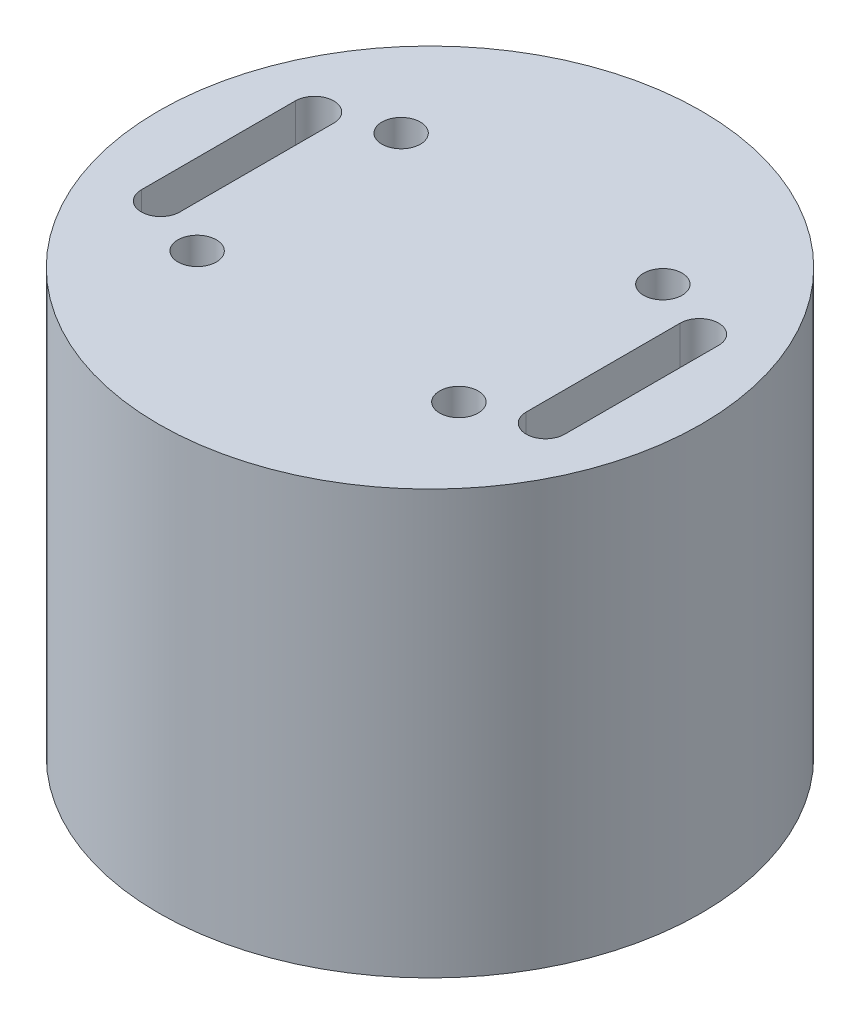
ISO-10303-21;
HEADER;
FILE_DESCRIPTION(('STEP AP214'),'2;1');
FILE_NAME('part.step','',(''),(''),'','','');
FILE_SCHEMA(('AUTOMOTIVE_DESIGN { 1 0 10303 214 1 1 1 1 }'));
ENDSEC;
DATA;
#1=APPLICATION_CONTEXT('core data for automotive mechanical design processes');
#2=APPLICATION_PROTOCOL_DEFINITION('international standard','automotive_design',2000,#1);
#3=PRODUCT_CONTEXT('',#1,'mechanical');
#4=PRODUCT('Part','Part','',(#3));
#5=PRODUCT_RELATED_PRODUCT_CATEGORY('part','',(#4));
#6=PRODUCT_DEFINITION_FORMATION('','',#4);
#7=PRODUCT_DEFINITION_CONTEXT('part definition',#1,'design');
#8=PRODUCT_DEFINITION('design','',#6,#7);
#9=PRODUCT_DEFINITION_SHAPE('','',#8);
#10=(LENGTH_UNIT() NAMED_UNIT(*) SI_UNIT(.MILLI.,.METRE.));
#11=(NAMED_UNIT(*) PLANE_ANGLE_UNIT() SI_UNIT($,.RADIAN.));
#12=(NAMED_UNIT(*) SI_UNIT($,.STERADIAN.) SOLID_ANGLE_UNIT());
#13=UNCERTAINTY_MEASURE_WITH_UNIT(LENGTH_MEASURE(1.E-05),#10,'distance_accuracy_value','');
#14=(GEOMETRIC_REPRESENTATION_CONTEXT(3) GLOBAL_UNCERTAINTY_ASSIGNED_CONTEXT((#13)) GLOBAL_UNIT_ASSIGNED_CONTEXT((#10,
#11,#12)) REPRESENTATION_CONTEXT('',''));
#15=CARTESIAN_POINT('',(0.,0.,0.));
#16=DIRECTION('',(0.,0.,1.));
#17=DIRECTION('',(1.,0.,0.));
#18=AXIS2_PLACEMENT_3D('',#15,#16,#17);
#19=CARTESIAN_POINT('',(0.,0.,0.));
#20=DIRECTION('',(0.,1.,0.));
#21=DIRECTION('',(0.,0.,1.));
#22=AXIS2_PLACEMENT_3D('',#19,#20,#21);
#23=PLANE('',#22);
#24=CARTESIAN_POINT('',(0.,0.,0.));
#25=DIRECTION('',(0.,-1.,0.));
#26=DIRECTION('',(0.,0.,-1.));
#27=AXIS2_PLACEMENT_3D('',#24,#25,#26);
#28=CIRCLE('',#27,60.5);
#29=CARTESIAN_POINT('',(0.,0.,-60.5));
#30=VERTEX_POINT('',#29);
#31=EDGE_CURVE('E199',#30,#30,#28,.T.);
#32=ORIENTED_EDGE('',*,*,#31,.T.);
#33=EDGE_LOOP('',(#32));
#34=FACE_BOUND('',#33,.T.);
#35=CARTESIAN_POINT('',(-34.,0.,-26.5));
#36=DIRECTION('',(0.,1.,0.));
#37=DIRECTION('',(0.,0.,1.));
#38=AXIS2_PLACEMENT_3D('',#35,#36,#37);
#39=CIRCLE('',#38,5.);
#40=CARTESIAN_POINT('',(-34.,0.,-21.5));
#41=VERTEX_POINT('',#40);
#42=EDGE_CURVE('E211',#41,#41,#39,.T.);
#43=ORIENTED_EDGE('',*,*,#42,.T.);
#44=EDGE_LOOP('',(#43));
#45=FACE_BOUND('',#44,.T.);
#46=CARTESIAN_POINT('',(34.,0.,-26.5));
#47=DIRECTION('',(0.,1.,0.));
#48=DIRECTION('',(0.,0.,1.));
#49=AXIS2_PLACEMENT_3D('',#46,#47,#48);
#50=CIRCLE('',#49,5.);
#51=CARTESIAN_POINT('',(34.,0.,-21.5));
#52=VERTEX_POINT('',#51);
#53=EDGE_CURVE('E225',#52,#52,#50,.T.);
#54=ORIENTED_EDGE('',*,*,#53,.T.);
#55=EDGE_LOOP('',(#54));
#56=FACE_BOUND('',#55,.T.);
#57=CARTESIAN_POINT('',(34.,0.,26.5));
#58=DIRECTION('',(0.,1.,0.));
#59=DIRECTION('',(0.,0.,1.));
#60=AXIS2_PLACEMENT_3D('',#57,#58,#59);
#61=CIRCLE('',#60,5.);
#62=CARTESIAN_POINT('',(34.,0.,31.5));
#63=VERTEX_POINT('',#62);
#64=EDGE_CURVE('E217',#63,#63,#61,.T.);
#65=ORIENTED_EDGE('',*,*,#64,.T.);
#66=EDGE_LOOP('',(#65));
#67=FACE_BOUND('',#66,.T.);
#68=CARTESIAN_POINT('',(-34.,0.,26.5));
#69=DIRECTION('',(0.,1.,0.));
#70=DIRECTION('',(0.,0.,1.));
#71=AXIS2_PLACEMENT_3D('',#68,#69,#70);
#72=CIRCLE('',#71,5.);
#73=CARTESIAN_POINT('',(-34.,0.,31.5));
#74=VERTEX_POINT('',#73);
#75=EDGE_CURVE('E53',#74,#74,#72,.T.);
#76=ORIENTED_EDGE('',*,*,#75,.T.);
#77=EDGE_LOOP('',(#76));
#78=FACE_BOUND('',#77,.T.);
#79=DIRECTION('',(0.,0.,-1.));
#80=VECTOR('',#79,1.);
#81=CARTESIAN_POINT('',(55.,0.,0.));
#82=LINE('',#81,#80);
#83=CARTESIAN_POINT('',(55.,0.,20.));
#84=VERTEX_POINT('',#83);
#85=CARTESIAN_POINT('',(55.,0.,-20.));
#86=VERTEX_POINT('',#85);
#87=EDGE_CURVE('E191',#84,#86,#82,.T.);
#88=ORIENTED_EDGE('',*,*,#87,.T.);
#89=CARTESIAN_POINT('',(50.,0.,-20.));
#90=DIRECTION('',(0.,1.,0.));
#91=DIRECTION('',(0.,0.,1.));
#92=AXIS2_PLACEMENT_3D('',#89,#90,#91);
#93=CIRCLE('',#92,5.00000000000001);
#94=CARTESIAN_POINT('',(45.,0.,-20.));
#95=VERTEX_POINT('',#94);
#96=EDGE_CURVE('E195',#86,#95,#93,.T.);
#97=ORIENTED_EDGE('',*,*,#96,.T.);
#98=DIRECTION('',(0.,0.,1.));
#99=VECTOR('',#98,1.);
#100=CARTESIAN_POINT('',(45.,0.,0.));
#101=LINE('',#100,#99);
#102=CARTESIAN_POINT('',(45.,0.,20.));
#103=VERTEX_POINT('',#102);
#104=EDGE_CURVE('E174',#95,#103,#101,.T.);
#105=ORIENTED_EDGE('',*,*,#104,.T.);
#106=CARTESIAN_POINT('',(50.,0.,20.));
#107=DIRECTION('',(0.,1.,0.));
#108=DIRECTION('',(0.,0.,1.));
#109=AXIS2_PLACEMENT_3D('',#106,#107,#108);
#110=CIRCLE('',#109,5.00000000000001);
#111=EDGE_CURVE('E187',#103,#84,#110,.T.);
#112=ORIENTED_EDGE('',*,*,#111,.T.);
#113=EDGE_LOOP('',(#88,#97,#105,#112));
#114=FACE_BOUND('',#113,.T.);
#115=CARTESIAN_POINT('',(-50.,0.,-20.));
#116=DIRECTION('',(0.,1.,0.));
#117=DIRECTION('',(0.,0.,1.));
#118=AXIS2_PLACEMENT_3D('',#115,#116,#117);
#119=CIRCLE('',#118,5.00000000000001);
#120=CARTESIAN_POINT('',(-55.,0.,-20.));
#121=VERTEX_POINT('',#120);
#122=CARTESIAN_POINT('',(-45.,0.,-20.));
#123=VERTEX_POINT('',#122);
#124=EDGE_CURVE('E152',#121,#123,#119,.F.);
#125=ORIENTED_EDGE('',*,*,#124,.F.);
#126=DIRECTION('',(0.,0.,-1.));
#127=VECTOR('',#126,1.);
#128=CARTESIAN_POINT('',(-55.,0.,0.));
#129=LINE('',#128,#127);
#130=CARTESIAN_POINT('',(-55.,0.,20.));
#131=VERTEX_POINT('',#130);
#132=EDGE_CURVE('E140',#131,#121,#129,.T.);
#133=ORIENTED_EDGE('',*,*,#132,.F.);
#134=CARTESIAN_POINT('',(-50.,0.,20.));
#135=DIRECTION('',(0.,1.,0.));
#136=DIRECTION('',(0.,0.,1.));
#137=AXIS2_PLACEMENT_3D('',#134,#135,#136);
#138=CIRCLE('',#137,5.00000000000001);
#139=CARTESIAN_POINT('',(-45.,0.,20.));
#140=VERTEX_POINT('',#139);
#141=EDGE_CURVE('E116',#140,#131,#138,.F.);
#142=ORIENTED_EDGE('',*,*,#141,.F.);
#143=DIRECTION('',(0.,0.,1.));
#144=VECTOR('',#143,1.);
#145=CARTESIAN_POINT('',(-45.,0.,0.));
#146=LINE('',#145,#144);
#147=EDGE_CURVE('E149',#123,#140,#146,.T.);
#148=ORIENTED_EDGE('',*,*,#147,.F.);
#149=EDGE_LOOP('',(#125,#133,#142,#148));
#150=FACE_BOUND('',#149,.T.);
#151=ADVANCED_FACE('F44',(#34,#45,#56,#67,#78,#114,#150),#23,.F.);
#152=CARTESIAN_POINT('',(0.,10.,0.));
#153=DIRECTION('',(0.,1.,0.));
#154=DIRECTION('',(0.,0.,1.));
#155=AXIS2_PLACEMENT_3D('',#152,#153,#154);
#156=PLANE('',#155);
#157=CARTESIAN_POINT('',(50.,10.,-20.));
#158=DIRECTION('',(0.,1.,0.));
#159=DIRECTION('',(0.,0.,1.));
#160=AXIS2_PLACEMENT_3D('',#157,#158,#159);
#161=CIRCLE('',#160,5.00000000000001);
#162=CARTESIAN_POINT('',(55.,10.,-20.));
#163=VERTEX_POINT('',#162);
#164=CARTESIAN_POINT('',(45.,10.,-20.));
#165=VERTEX_POINT('',#164);
#166=EDGE_CURVE('E155',#163,#165,#161,.T.);
#167=ORIENTED_EDGE('',*,*,#166,.F.);
#168=DIRECTION('',(0.,0.,-1.));
#169=VECTOR('',#168,1.);
#170=CARTESIAN_POINT('',(55.,10.,-20.));
#171=LINE('',#170,#169);
#172=CARTESIAN_POINT('',(55.,10.,20.));
#173=VERTEX_POINT('',#172);
#174=EDGE_CURVE('E166',#173,#163,#171,.T.);
#175=ORIENTED_EDGE('',*,*,#174,.F.);
#176=CARTESIAN_POINT('',(50.,10.,20.));
#177=DIRECTION('',(0.,1.,0.));
#178=DIRECTION('',(0.,0.,1.));
#179=AXIS2_PLACEMENT_3D('',#176,#177,#178);
#180=CIRCLE('',#179,5.00000000000001);
#181=CARTESIAN_POINT('',(45.,10.,20.));
#182=VERTEX_POINT('',#181);
#183=EDGE_CURVE('E162',#182,#173,#180,.T.);
#184=ORIENTED_EDGE('',*,*,#183,.F.);
#185=DIRECTION('',(0.,0.,1.));
#186=VECTOR('',#185,1.);
#187=CARTESIAN_POINT('',(45.,10.,-20.));
#188=LINE('',#187,#186);
#189=EDGE_CURVE('E158',#165,#182,#188,.T.);
#190=ORIENTED_EDGE('',*,*,#189,.F.);
#191=EDGE_LOOP('',(#167,#175,#184,#190));
#192=FACE_BOUND('',#191,.T.);
#193=CARTESIAN_POINT('',(-34.,10.,-26.5));
#194=DIRECTION('',(0.,1.,0.));
#195=DIRECTION('',(0.,0.,1.));
#196=AXIS2_PLACEMENT_3D('',#193,#194,#195);
#197=CIRCLE('',#196,5.);
#198=CARTESIAN_POINT('',(-34.,10.,-21.5));
#199=VERTEX_POINT('',#198);
#200=EDGE_CURVE('E229',#199,#199,#197,.T.);
#201=ORIENTED_EDGE('',*,*,#200,.F.);
#202=EDGE_LOOP('',(#201));
#203=FACE_BOUND('',#202,.T.);
#204=CARTESIAN_POINT('',(34.,10.,-26.5));
#205=DIRECTION('',(0.,1.,0.));
#206=DIRECTION('',(0.,0.,1.));
#207=AXIS2_PLACEMENT_3D('',#204,#205,#206);
#208=CIRCLE('',#207,5.);
#209=CARTESIAN_POINT('',(34.,10.,-21.5));
#210=VERTEX_POINT('',#209);
#211=EDGE_CURVE('E221',#210,#210,#208,.T.);
#212=ORIENTED_EDGE('',*,*,#211,.F.);
#213=EDGE_LOOP('',(#212));
#214=FACE_BOUND('',#213,.T.);
#215=CARTESIAN_POINT('',(34.,10.,26.5));
#216=DIRECTION('',(0.,1.,0.));
#217=DIRECTION('',(0.,0.,1.));
#218=AXIS2_PLACEMENT_3D('',#215,#216,#217);
#219=CIRCLE('',#218,5.);
#220=CARTESIAN_POINT('',(34.,10.,31.5));
#221=VERTEX_POINT('',#220);
#222=EDGE_CURVE('E212',#221,#221,#219,.T.);
#223=ORIENTED_EDGE('',*,*,#222,.F.);
#224=EDGE_LOOP('',(#223));
#225=FACE_BOUND('',#224,.T.);
#226=CARTESIAN_POINT('',(-34.,10.,26.5));
#227=DIRECTION('',(0.,1.,0.));
#228=DIRECTION('',(0.,0.,1.));
#229=AXIS2_PLACEMENT_3D('',#226,#227,#228);
#230=CIRCLE('',#229,5.);
#231=CARTESIAN_POINT('',(-34.,10.,31.5));
#232=VERTEX_POINT('',#231);
#233=EDGE_CURVE('E216',#232,#232,#230,.T.);
#234=ORIENTED_EDGE('',*,*,#233,.F.);
#235=EDGE_LOOP('',(#234));
#236=FACE_BOUND('',#235,.T.);
#237=CARTESIAN_POINT('',(0.,10.,0.));
#238=DIRECTION('',(0.,1.,0.));
#239=DIRECTION('',(0.,0.,1.));
#240=AXIS2_PLACEMENT_3D('',#237,#238,#239);
#241=CIRCLE('',#240,70.5);
#242=CARTESIAN_POINT('',(0.,10.,70.5));
#243=VERTEX_POINT('',#242);
#244=EDGE_CURVE('E11',#243,#243,#241,.T.);
#245=ORIENTED_EDGE('',*,*,#244,.T.);
#246=EDGE_LOOP('',(#245));
#247=FACE_BOUND('',#246,.T.);
#248=DIRECTION('',(0.,0.,-1.));
#249=VECTOR('',#248,1.);
#250=CARTESIAN_POINT('',(-55.,10.,-20.));
#251=LINE('',#250,#249);
#252=CARTESIAN_POINT('',(-55.,10.,20.));
#253=VERTEX_POINT('',#252);
#254=CARTESIAN_POINT('',(-55.,10.,-20.));
#255=VERTEX_POINT('',#254);
#256=EDGE_CURVE('E123',#253,#255,#251,.T.);
#257=ORIENTED_EDGE('',*,*,#256,.T.);
#258=CARTESIAN_POINT('',(-50.,10.,-20.));
#259=DIRECTION('',(0.,-1.,0.));
#260=DIRECTION('',(0.,0.,1.));
#261=AXIS2_PLACEMENT_3D('',#258,#259,#260);
#262=CIRCLE('',#261,5.00000000000001);
#263=CARTESIAN_POINT('',(-45.,10.,-20.));
#264=VERTEX_POINT('',#263);
#265=EDGE_CURVE('E68',#255,#264,#262,.T.);
#266=ORIENTED_EDGE('',*,*,#265,.T.);
#267=DIRECTION('',(0.,0.,1.));
#268=VECTOR('',#267,1.);
#269=CARTESIAN_POINT('',(-45.,10.,-20.));
#270=LINE('',#269,#268);
#271=CARTESIAN_POINT('',(-45.,10.,20.));
#272=VERTEX_POINT('',#271);
#273=EDGE_CURVE('E130',#264,#272,#270,.T.);
#274=ORIENTED_EDGE('',*,*,#273,.T.);
#275=CARTESIAN_POINT('',(-50.,10.,20.));
#276=DIRECTION('',(0.,-1.,0.));
#277=DIRECTION('',(0.,0.,1.));
#278=AXIS2_PLACEMENT_3D('',#275,#276,#277);
#279=CIRCLE('',#278,5.00000000000001);
#280=EDGE_CURVE('E113',#272,#253,#279,.T.);
#281=ORIENTED_EDGE('',*,*,#280,.T.);
#282=EDGE_LOOP('',(#257,#266,#274,#281));
#283=FACE_BOUND('',#282,.T.);
#284=ADVANCED_FACE('F128',(#192,#203,#214,#225,#236,#247,#283),#156,.T.);
#285=CARTESIAN_POINT('',(0.,10.,0.));
#286=DIRECTION('',(0.,-1.,0.));
#287=DIRECTION('',(0.,0.,-1.));
#288=AXIS2_PLACEMENT_3D('',#285,#286,#287);
#289=CYLINDRICAL_SURFACE('',#288,70.5);
#290=ORIENTED_EDGE('',*,*,#244,.F.);
#291=EDGE_LOOP('',(#290));
#292=FACE_BOUND('',#291,.T.);
#293=CARTESIAN_POINT('',(0.,-100.,0.));
#294=DIRECTION('',(0.,-1.,0.));
#295=DIRECTION('',(0.,0.,-1.));
#296=AXIS2_PLACEMENT_3D('',#293,#294,#295);
#297=CIRCLE('',#296,70.5);
#298=CARTESIAN_POINT('',(0.,-100.,-70.5));
#299=VERTEX_POINT('',#298);
#300=EDGE_CURVE('E204',#299,#299,#297,.T.);
#301=ORIENTED_EDGE('',*,*,#300,.F.);
#302=EDGE_LOOP('',(#301));
#303=FACE_BOUND('',#302,.T.);
#304=ADVANCED_FACE('F46',(#292,#303),#289,.T.);
#305=CARTESIAN_POINT('',(-34.,0.,26.5));
#306=DIRECTION('',(0.,1.,0.));
#307=DIRECTION('',(0.,0.,1.));
#308=AXIS2_PLACEMENT_3D('',#305,#306,#307);
#309=CYLINDRICAL_SURFACE('',#308,5.);
#310=ORIENTED_EDGE('',*,*,#75,.F.);
#311=EDGE_LOOP('',(#310));
#312=FACE_BOUND('',#311,.T.);
#313=ORIENTED_EDGE('',*,*,#233,.T.);
#314=EDGE_LOOP('',(#313));
#315=FACE_BOUND('',#314,.T.);
#316=ADVANCED_FACE('F242',(#312,#315),#309,.F.);
#317=CARTESIAN_POINT('',(34.,0.,26.5));
#318=DIRECTION('',(0.,1.,0.));
#319=DIRECTION('',(0.,0.,1.));
#320=AXIS2_PLACEMENT_3D('',#317,#318,#319);
#321=CYLINDRICAL_SURFACE('',#320,5.);
#322=ORIENTED_EDGE('',*,*,#64,.F.);
#323=EDGE_LOOP('',(#322));
#324=FACE_BOUND('',#323,.T.);
#325=ORIENTED_EDGE('',*,*,#222,.T.);
#326=EDGE_LOOP('',(#325));
#327=FACE_BOUND('',#326,.T.);
#328=ADVANCED_FACE('F312',(#324,#327),#321,.F.);
#329=CARTESIAN_POINT('',(34.,0.,-26.5));
#330=DIRECTION('',(0.,1.,0.));
#331=DIRECTION('',(0.,0.,1.));
#332=AXIS2_PLACEMENT_3D('',#329,#330,#331);
#333=CYLINDRICAL_SURFACE('',#332,5.);
#334=ORIENTED_EDGE('',*,*,#53,.F.);
#335=EDGE_LOOP('',(#334));
#336=FACE_BOUND('',#335,.T.);
#337=ORIENTED_EDGE('',*,*,#211,.T.);
#338=EDGE_LOOP('',(#337));
#339=FACE_BOUND('',#338,.T.);
#340=ADVANCED_FACE('F315',(#336,#339),#333,.F.);
#341=CARTESIAN_POINT('',(-34.,0.,-26.5));
#342=DIRECTION('',(0.,1.,0.));
#343=DIRECTION('',(0.,0.,1.));
#344=AXIS2_PLACEMENT_3D('',#341,#342,#343);
#345=CYLINDRICAL_SURFACE('',#344,5.);
#346=ORIENTED_EDGE('',*,*,#42,.F.);
#347=EDGE_LOOP('',(#346));
#348=FACE_BOUND('',#347,.T.);
#349=ORIENTED_EDGE('',*,*,#200,.T.);
#350=EDGE_LOOP('',(#349));
#351=FACE_BOUND('',#350,.T.);
#352=ADVANCED_FACE('F258',(#348,#351),#345,.F.);
#353=CARTESIAN_POINT('',(0.,-100.,0.));
#354=DIRECTION('',(0.,-1.,0.));
#355=DIRECTION('',(0.,0.,-1.));
#356=AXIS2_PLACEMENT_3D('',#353,#354,#355);
#357=PLANE('',#356);
#358=ORIENTED_EDGE('',*,*,#300,.T.);
#359=EDGE_LOOP('',(#358));
#360=FACE_BOUND('',#359,.T.);
#361=CARTESIAN_POINT('',(0.,-100.,0.));
#362=DIRECTION('',(0.,-1.,0.));
#363=DIRECTION('',(0.,0.,-1.));
#364=AXIS2_PLACEMENT_3D('',#361,#362,#363);
#365=CIRCLE('',#364,60.5);
#366=CARTESIAN_POINT('',(0.,-100.,-60.5));
#367=VERTEX_POINT('',#366);
#368=EDGE_CURVE('E200',#367,#367,#365,.T.);
#369=ORIENTED_EDGE('',*,*,#368,.F.);
#370=EDGE_LOOP('',(#369));
#371=FACE_BOUND('',#370,.T.);
#372=ADVANCED_FACE('F254',(#360,#371),#357,.T.);
#373=CARTESIAN_POINT('',(0.,-100.,0.));
#374=DIRECTION('',(0.,1.,0.));
#375=DIRECTION('',(0.,0.,1.));
#376=AXIS2_PLACEMENT_3D('',#373,#374,#375);
#377=CYLINDRICAL_SURFACE('',#376,60.5);
#378=ORIENTED_EDGE('',*,*,#368,.T.);
#379=EDGE_LOOP('',(#378));
#380=FACE_BOUND('',#379,.T.);
#381=ORIENTED_EDGE('',*,*,#31,.F.);
#382=EDGE_LOOP('',(#381));
#383=FACE_BOUND('',#382,.T.);
#384=ADVANCED_FACE('F257',(#380,#383),#377,.F.);
#385=CARTESIAN_POINT('',(50.,-100.,-20.));
#386=DIRECTION('',(0.,1.,0.));
#387=DIRECTION('',(0.,0.,1.));
#388=AXIS2_PLACEMENT_3D('',#385,#386,#387);
#389=CYLINDRICAL_SURFACE('',#388,5.00000000000001);
#390=DIRECTION('',(0.,1.,0.));
#391=VECTOR('',#390,1.);
#392=CARTESIAN_POINT('',(55.,-100.,-20.));
#393=LINE('',#392,#391);
#394=EDGE_CURVE('E171',#86,#163,#393,.T.);
#395=ORIENTED_EDGE('',*,*,#394,.T.);
#396=ORIENTED_EDGE('',*,*,#166,.T.);
#397=DIRECTION('',(0.,1.,0.));
#398=VECTOR('',#397,1.);
#399=CARTESIAN_POINT('',(45.,-100.,-20.));
#400=LINE('',#399,#398);
#401=EDGE_CURVE('E170',#95,#165,#400,.T.);
#402=ORIENTED_EDGE('',*,*,#401,.F.);
#403=ORIENTED_EDGE('',*,*,#96,.F.);
#404=EDGE_LOOP('',(#395,#396,#402,#403));
#405=FACE_BOUND('',#404,.T.);
#406=ADVANCED_FACE('F264',(#405),#389,.F.);
#407=CARTESIAN_POINT('',(55.,-100.,-20.));
#408=DIRECTION('',(1.,0.,0.));
#409=DIRECTION('',(0.,0.,-1.));
#410=AXIS2_PLACEMENT_3D('',#407,#408,#409);
#411=PLANE('',#410);
#412=DIRECTION('',(0.,1.,0.));
#413=VECTOR('',#412,1.);
#414=CARTESIAN_POINT('',(55.,-100.,20.));
#415=LINE('',#414,#413);
#416=EDGE_CURVE('E175',#84,#173,#415,.T.);
#417=ORIENTED_EDGE('',*,*,#416,.T.);
#418=ORIENTED_EDGE('',*,*,#174,.T.);
#419=ORIENTED_EDGE('',*,*,#394,.F.);
#420=ORIENTED_EDGE('',*,*,#87,.F.);
#421=EDGE_LOOP('',(#417,#418,#419,#420));
#422=FACE_BOUND('',#421,.T.);
#423=ADVANCED_FACE('F298',(#422),#411,.F.);
#424=CARTESIAN_POINT('',(50.,-100.,20.));
#425=DIRECTION('',(0.,1.,0.));
#426=DIRECTION('',(0.,0.,1.));
#427=AXIS2_PLACEMENT_3D('',#424,#425,#426);
#428=CYLINDRICAL_SURFACE('',#427,5.00000000000001);
#429=DIRECTION('',(0.,1.,0.));
#430=VECTOR('',#429,1.);
#431=CARTESIAN_POINT('',(45.,-100.,20.));
#432=LINE('',#431,#430);
#433=EDGE_CURVE('E178',#103,#182,#432,.T.);
#434=ORIENTED_EDGE('',*,*,#433,.T.);
#435=ORIENTED_EDGE('',*,*,#183,.T.);
#436=ORIENTED_EDGE('',*,*,#416,.F.);
#437=ORIENTED_EDGE('',*,*,#111,.F.);
#438=EDGE_LOOP('',(#434,#435,#436,#437));
#439=FACE_BOUND('',#438,.T.);
#440=ADVANCED_FACE('F301',(#439),#428,.F.);
#441=CARTESIAN_POINT('',(45.,-100.,-20.));
#442=DIRECTION('',(-1.,0.,0.));
#443=DIRECTION('',(0.,0.,1.));
#444=AXIS2_PLACEMENT_3D('',#441,#442,#443);
#445=PLANE('',#444);
#446=ORIENTED_EDGE('',*,*,#401,.T.);
#447=ORIENTED_EDGE('',*,*,#189,.T.);
#448=ORIENTED_EDGE('',*,*,#433,.F.);
#449=ORIENTED_EDGE('',*,*,#104,.F.);
#450=EDGE_LOOP('',(#446,#447,#448,#449));
#451=FACE_BOUND('',#450,.T.);
#452=ADVANCED_FACE('F293',(#451),#445,.F.);
#453=CARTESIAN_POINT('',(-50.,-100.,-20.));
#454=DIRECTION('',(0.,1.,0.));
#455=DIRECTION('',(0.,0.,1.));
#456=AXIS2_PLACEMENT_3D('',#453,#454,#455);
#457=CYLINDRICAL_SURFACE('',#456,5.00000000000001);
#458=ORIENTED_EDGE('',*,*,#124,.T.);
#459=DIRECTION('',(0.,1.,0.));
#460=VECTOR('',#459,1.);
#461=CARTESIAN_POINT('',(-45.,-100.,-20.));
#462=LINE('',#461,#460);
#463=EDGE_CURVE('E137',#123,#264,#462,.T.);
#464=ORIENTED_EDGE('',*,*,#463,.T.);
#465=ORIENTED_EDGE('',*,*,#265,.F.);
#466=DIRECTION('',(0.,1.,0.));
#467=VECTOR('',#466,1.);
#468=CARTESIAN_POINT('',(-55.,-100.,-20.));
#469=LINE('',#468,#467);
#470=EDGE_CURVE('E120',#121,#255,#469,.T.);
#471=ORIENTED_EDGE('',*,*,#470,.F.);
#472=EDGE_LOOP('',(#458,#464,#465,#471));
#473=FACE_BOUND('',#472,.T.);
#474=ADVANCED_FACE('F282',(#473),#457,.F.);
#475=CARTESIAN_POINT('',(-45.,-100.,-20.));
#476=DIRECTION('',(-1.,0.,0.));
#477=DIRECTION('',(0.,0.,1.));
#478=AXIS2_PLACEMENT_3D('',#475,#476,#477);
#479=PLANE('',#478);
#480=ORIENTED_EDGE('',*,*,#147,.T.);
#481=DIRECTION('',(0.,1.,0.));
#482=VECTOR('',#481,1.);
#483=CARTESIAN_POINT('',(-45.,-100.,20.));
#484=LINE('',#483,#482);
#485=EDGE_CURVE('E119',#140,#272,#484,.T.);
#486=ORIENTED_EDGE('',*,*,#485,.T.);
#487=ORIENTED_EDGE('',*,*,#273,.F.);
#488=ORIENTED_EDGE('',*,*,#463,.F.);
#489=EDGE_LOOP('',(#480,#486,#487,#488));
#490=FACE_BOUND('',#489,.T.);
#491=ADVANCED_FACE('F284',(#490),#479,.T.);
#492=CARTESIAN_POINT('',(-50.,-100.,20.));
#493=DIRECTION('',(0.,1.,0.));
#494=DIRECTION('',(0.,0.,1.));
#495=AXIS2_PLACEMENT_3D('',#492,#493,#494);
#496=CYLINDRICAL_SURFACE('',#495,5.00000000000001);
#497=ORIENTED_EDGE('',*,*,#141,.T.);
#498=DIRECTION('',(0.,1.,0.));
#499=VECTOR('',#498,1.);
#500=CARTESIAN_POINT('',(-55.,-100.,20.));
#501=LINE('',#500,#499);
#502=EDGE_CURVE('E60',#131,#253,#501,.T.);
#503=ORIENTED_EDGE('',*,*,#502,.T.);
#504=ORIENTED_EDGE('',*,*,#280,.F.);
#505=ORIENTED_EDGE('',*,*,#485,.F.);
#506=EDGE_LOOP('',(#497,#503,#504,#505));
#507=FACE_BOUND('',#506,.T.);
#508=ADVANCED_FACE('F110',(#507),#496,.F.);
#509=CARTESIAN_POINT('',(-55.,-100.,-20.));
#510=DIRECTION('',(1.,0.,0.));
#511=DIRECTION('',(0.,0.,-1.));
#512=AXIS2_PLACEMENT_3D('',#509,#510,#511);
#513=PLANE('',#512);
#514=ORIENTED_EDGE('',*,*,#132,.T.);
#515=ORIENTED_EDGE('',*,*,#470,.T.);
#516=ORIENTED_EDGE('',*,*,#256,.F.);
#517=ORIENTED_EDGE('',*,*,#502,.F.);
#518=EDGE_LOOP('',(#514,#515,#516,#517));
#519=FACE_BOUND('',#518,.T.);
#520=ADVANCED_FACE('F124',(#519),#513,.T.);
#521=CLOSED_SHELL('',(#151,#284,#304,#316,#328,#340,#352,#372,#384,#406,#423,#440,#452,#474,
#491,#508,#520));
#522=MANIFOLD_SOLID_BREP('B2',#521);
#523=ADVANCED_BREP_SHAPE_REPRESENTATION('',(#18,#522),#14);
#524=SHAPE_DEFINITION_REPRESENTATION(#9,#523);
ENDSEC;
END-ISO-10303-21;
